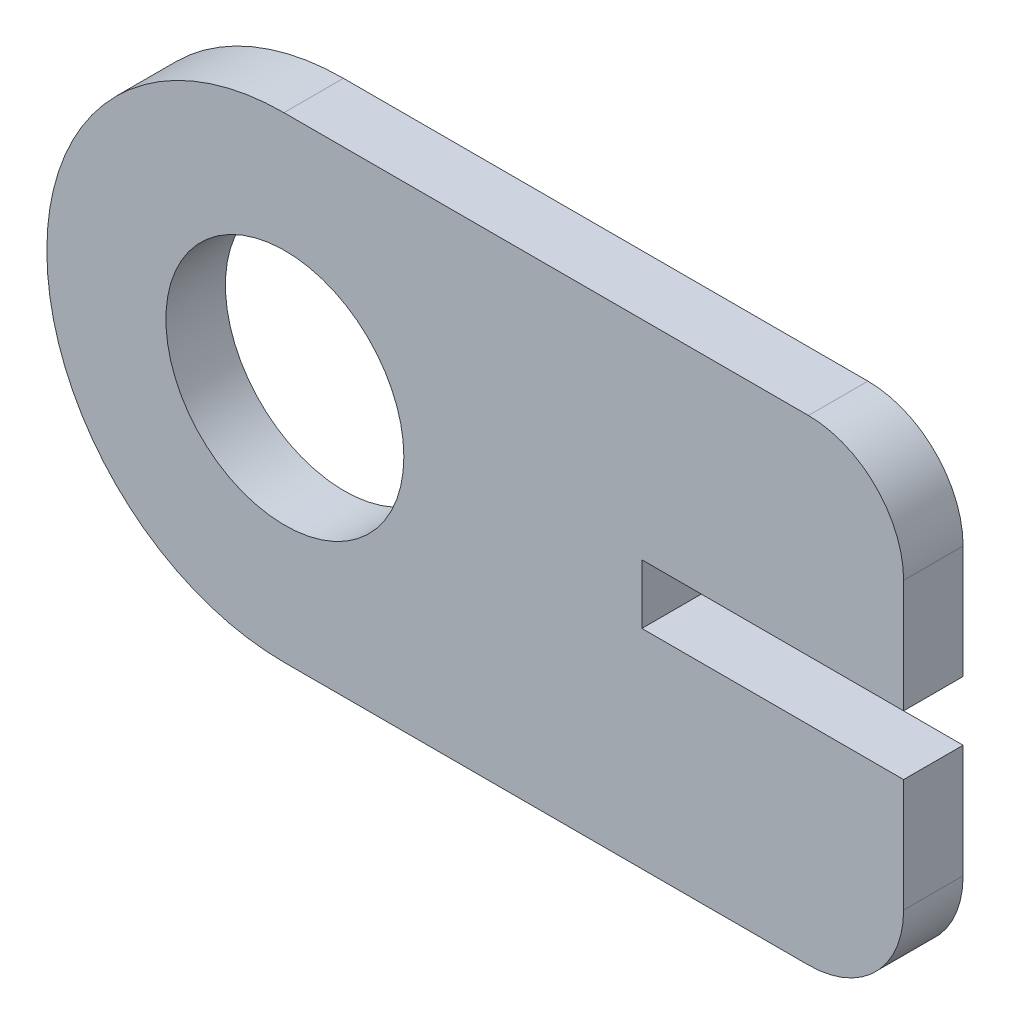
ISO-10303-21;
HEADER;
FILE_DESCRIPTION(('STEP AP214'),'2;1');
FILE_NAME('part.step','',(''),(''),'','','');
FILE_SCHEMA(('AUTOMOTIVE_DESIGN { 1 0 10303 214 1 1 1 1 }'));
ENDSEC;
DATA;
#1=APPLICATION_CONTEXT('core data for automotive mechanical design processes');
#2=APPLICATION_PROTOCOL_DEFINITION('international standard','automotive_design',2000,#1);
#3=PRODUCT_CONTEXT('',#1,'mechanical');
#4=PRODUCT('Part','Part','',(#3));
#5=PRODUCT_RELATED_PRODUCT_CATEGORY('part','',(#4));
#6=PRODUCT_DEFINITION_FORMATION('','',#4);
#7=PRODUCT_DEFINITION_CONTEXT('part definition',#1,'design');
#8=PRODUCT_DEFINITION('design','',#6,#7);
#9=PRODUCT_DEFINITION_SHAPE('','',#8);
#10=(LENGTH_UNIT() NAMED_UNIT(*) SI_UNIT(.MILLI.,.METRE.));
#11=(NAMED_UNIT(*) PLANE_ANGLE_UNIT() SI_UNIT($,.RADIAN.));
#12=(NAMED_UNIT(*) SI_UNIT($,.STERADIAN.) SOLID_ANGLE_UNIT());
#13=UNCERTAINTY_MEASURE_WITH_UNIT(LENGTH_MEASURE(1.E-05),#10,'distance_accuracy_value','');
#14=(GEOMETRIC_REPRESENTATION_CONTEXT(3) GLOBAL_UNCERTAINTY_ASSIGNED_CONTEXT((#13)) GLOBAL_UNIT_ASSIGNED_CONTEXT((#10,
#11,#12)) REPRESENTATION_CONTEXT('',''));
#15=CARTESIAN_POINT('',(0.,0.,0.));
#16=DIRECTION('',(0.,0.,1.));
#17=DIRECTION('',(1.,0.,0.));
#18=AXIS2_PLACEMENT_3D('',#15,#16,#17);
#19=CARTESIAN_POINT('',(13.97,-3.81,1.5875));
#20=DIRECTION('',(0.,0.,1.));
#21=DIRECTION('',(1.,0.,0.));
#22=AXIS2_PLACEMENT_3D('',#19,#20,#21);
#23=PLANE('',#22);
#24=DIRECTION('',(1.,0.,0.));
#25=VECTOR('',#24,1.);
#26=CARTESIAN_POINT('',(16.51,0.793749999999999,1.5875));
#27=LINE('',#26,#25);
#28=CARTESIAN_POINT('',(9.525,0.79375,1.5875));
#29=VERTEX_POINT('',#28);
#30=CARTESIAN_POINT('',(16.51,0.793749999999999,1.5875));
#31=VERTEX_POINT('',#30);
#32=EDGE_CURVE('E181',#29,#31,#27,.T.);
#33=ORIENTED_EDGE('',*,*,#32,.T.);
#34=DIRECTION('',(0.,1.,0.));
#35=VECTOR('',#34,1.);
#36=CARTESIAN_POINT('',(16.51,3.80999999999998,1.5875));
#37=LINE('',#36,#35);
#38=CARTESIAN_POINT('',(16.51,3.80999999999998,1.5875));
#39=VERTEX_POINT('',#38);
#40=EDGE_CURVE('E109',#31,#39,#37,.T.);
#41=ORIENTED_EDGE('',*,*,#40,.T.);
#42=CARTESIAN_POINT('',(13.97,3.81,1.5875));
#43=DIRECTION('',(0.,0.,1.));
#44=DIRECTION('',(-1.,0.,0.));
#45=AXIS2_PLACEMENT_3D('',#42,#43,#44);
#46=CIRCLE('',#45,2.54);
#47=CARTESIAN_POINT('',(13.97,6.35,1.5875));
#48=VERTEX_POINT('',#47);
#49=EDGE_CURVE('E208',#39,#48,#46,.T.);
#50=ORIENTED_EDGE('',*,*,#49,.T.);
#51=DIRECTION('',(-1.,0.,0.));
#52=VECTOR('',#51,1.);
#53=CARTESIAN_POINT('',(-0.0253999999999541,6.35,1.5875));
#54=LINE('',#53,#52);
#55=CARTESIAN_POINT('',(-0.0253999999999541,6.35,1.5875));
#56=VERTEX_POINT('',#55);
#57=EDGE_CURVE('E227',#48,#56,#54,.T.);
#58=ORIENTED_EDGE('',*,*,#57,.T.);
#59=CARTESIAN_POINT('',(-0.0253999999999983,0.0254000000000001,1.5875));
#60=DIRECTION('',(0.,0.,1.));
#61=DIRECTION('',(1.,0.,0.));
#62=AXIS2_PLACEMENT_3D('',#59,#60,#61);
#63=CIRCLE('',#62,6.3246);
#64=CARTESIAN_POINT('',(-6.35,0.0253999999999587,1.5875));
#65=VERTEX_POINT('',#64);
#66=EDGE_CURVE('E224',#56,#65,#63,.T.);
#67=ORIENTED_EDGE('',*,*,#66,.T.);
#68=DIRECTION('',(0.,-1.,0.));
#69=VECTOR('',#68,1.);
#70=CARTESIAN_POINT('',(-6.35,0.0253999999999558,1.5875));
#71=LINE('',#70,#69);
#72=CARTESIAN_POINT('',(-6.35,-0.025399999999955,1.5875));
#73=VERTEX_POINT('',#72);
#74=EDGE_CURVE('E226',#65,#73,#71,.T.);
#75=ORIENTED_EDGE('',*,*,#74,.T.);
#76=CARTESIAN_POINT('',(-0.0253999999999983,-0.0253999999999992,1.5875));
#77=DIRECTION('',(0.,0.,1.));
#78=DIRECTION('',(1.,0.,0.));
#79=AXIS2_PLACEMENT_3D('',#76,#77,#78);
#80=CIRCLE('',#79,6.3246);
#81=CARTESIAN_POINT('',(-0.0253999999999546,-6.35,1.5875));
#82=VERTEX_POINT('',#81);
#83=EDGE_CURVE('E229',#73,#82,#80,.T.);
#84=ORIENTED_EDGE('',*,*,#83,.T.);
#85=DIRECTION('',(1.,0.,0.));
#86=VECTOR('',#85,1.);
#87=CARTESIAN_POINT('',(-0.0253999999999541,-6.35,1.5875));
#88=LINE('',#87,#86);
#89=CARTESIAN_POINT('',(13.97,-6.35,1.5875));
#90=VERTEX_POINT('',#89);
#91=EDGE_CURVE('E235',#82,#90,#88,.T.);
#92=ORIENTED_EDGE('',*,*,#91,.T.);
#93=CARTESIAN_POINT('',(13.97,-3.81,1.5875));
#94=DIRECTION('',(0.,0.,1.));
#95=DIRECTION('',(1.,0.,0.));
#96=AXIS2_PLACEMENT_3D('',#93,#94,#95);
#97=CIRCLE('',#96,2.54);
#98=CARTESIAN_POINT('',(16.51,-3.80999999999998,1.5875));
#99=VERTEX_POINT('',#98);
#100=EDGE_CURVE('E140',#90,#99,#97,.T.);
#101=ORIENTED_EDGE('',*,*,#100,.T.);
#102=DIRECTION('',(0.,1.,0.));
#103=VECTOR('',#102,1.);
#104=CARTESIAN_POINT('',(16.51,-0.793749999999999,1.5875));
#105=LINE('',#104,#103);
#106=CARTESIAN_POINT('',(16.51,-0.793749999999999,1.5875));
#107=VERTEX_POINT('',#106);
#108=EDGE_CURVE('E134',#99,#107,#105,.T.);
#109=ORIENTED_EDGE('',*,*,#108,.T.);
#110=DIRECTION('',(-1.,0.,0.));
#111=VECTOR('',#110,1.);
#112=CARTESIAN_POINT('',(16.51,-0.793749999999999,1.5875));
#113=LINE('',#112,#111);
#114=CARTESIAN_POINT('',(9.525,-0.79375,1.5875));
#115=VERTEX_POINT('',#114);
#116=EDGE_CURVE('E138',#107,#115,#113,.T.);
#117=ORIENTED_EDGE('',*,*,#116,.T.);
#118=DIRECTION('',(0.,1.,0.));
#119=VECTOR('',#118,1.);
#120=CARTESIAN_POINT('',(9.525,0.79375,1.5875));
#121=LINE('',#120,#119);
#122=EDGE_CURVE('E54',#115,#29,#121,.T.);
#123=ORIENTED_EDGE('',*,*,#122,.T.);
#124=EDGE_LOOP('',(#33,#41,#50,#58,#67,#75,#84,#92,#101,#109,#117,#123));
#125=FACE_BOUND('',#124,.T.);
#126=CARTESIAN_POINT('',(0.,0.,1.5875));
#127=DIRECTION('',(0.,0.,1.));
#128=DIRECTION('',(1.,0.,0.));
#129=AXIS2_PLACEMENT_3D('',#126,#127,#128);
#130=CIRCLE('',#129,3.175);
#131=CARTESIAN_POINT('',(3.175,0.,1.5875));
#132=VERTEX_POINT('',#131);
#133=EDGE_CURVE('E162',#132,#132,#130,.T.);
#134=ORIENTED_EDGE('',*,*,#133,.F.);
#135=EDGE_LOOP('',(#134));
#136=FACE_BOUND('',#135,.T.);
#137=ADVANCED_FACE('F37',(#125,#136),#23,.T.);
#138=CARTESIAN_POINT('',(13.97,-3.81,0.));
#139=DIRECTION('',(0.,0.,1.));
#140=DIRECTION('',(1.,0.,0.));
#141=AXIS2_PLACEMENT_3D('',#138,#139,#140);
#142=PLANE('',#141);
#143=DIRECTION('',(1.,0.,0.));
#144=VECTOR('',#143,1.);
#145=CARTESIAN_POINT('',(16.51,0.793749999999999,0.));
#146=LINE('',#145,#144);
#147=CARTESIAN_POINT('',(9.525,0.79375,0.));
#148=VERTEX_POINT('',#147);
#149=CARTESIAN_POINT('',(16.51,0.793749999999999,0.));
#150=VERTEX_POINT('',#149);
#151=EDGE_CURVE('E158',#148,#150,#146,.T.);
#152=ORIENTED_EDGE('',*,*,#151,.F.);
#153=DIRECTION('',(0.,1.,0.));
#154=VECTOR('',#153,1.);
#155=CARTESIAN_POINT('',(9.525,0.79375,0.));
#156=LINE('',#155,#154);
#157=CARTESIAN_POINT('',(9.525,-0.79375,0.));
#158=VERTEX_POINT('',#157);
#159=EDGE_CURVE('E101',#158,#148,#156,.T.);
#160=ORIENTED_EDGE('',*,*,#159,.F.);
#161=DIRECTION('',(-1.,0.,0.));
#162=VECTOR('',#161,1.);
#163=CARTESIAN_POINT('',(16.51,-0.793749999999999,0.));
#164=LINE('',#163,#162);
#165=CARTESIAN_POINT('',(16.51,-0.793749999999999,0.));
#166=VERTEX_POINT('',#165);
#167=EDGE_CURVE('E95',#166,#158,#164,.T.);
#168=ORIENTED_EDGE('',*,*,#167,.F.);
#169=DIRECTION('',(0.,1.,0.));
#170=VECTOR('',#169,1.);
#171=CARTESIAN_POINT('',(16.51,-0.793749999999999,0.));
#172=LINE('',#171,#170);
#173=CARTESIAN_POINT('',(16.51,-3.80999999999998,0.));
#174=VERTEX_POINT('',#173);
#175=EDGE_CURVE('E148',#174,#166,#172,.T.);
#176=ORIENTED_EDGE('',*,*,#175,.F.);
#177=CARTESIAN_POINT('',(13.97,-3.81,0.));
#178=DIRECTION('',(0.,0.,1.));
#179=DIRECTION('',(1.,0.,0.));
#180=AXIS2_PLACEMENT_3D('',#177,#178,#179);
#181=CIRCLE('',#180,2.54);
#182=CARTESIAN_POINT('',(13.97,-6.35,0.));
#183=VERTEX_POINT('',#182);
#184=EDGE_CURVE('E176',#183,#174,#181,.T.);
#185=ORIENTED_EDGE('',*,*,#184,.F.);
#186=DIRECTION('',(1.,0.,0.));
#187=VECTOR('',#186,1.);
#188=CARTESIAN_POINT('',(-0.0253999999999541,-6.35,0.));
#189=LINE('',#188,#187);
#190=CARTESIAN_POINT('',(-0.0253999999999546,-6.35,0.));
#191=VERTEX_POINT('',#190);
#192=EDGE_CURVE('E174',#191,#183,#189,.T.);
#193=ORIENTED_EDGE('',*,*,#192,.F.);
#194=CARTESIAN_POINT('',(-0.0253999999999983,-0.0253999999999992,0.));
#195=DIRECTION('',(0.,0.,1.));
#196=DIRECTION('',(1.,0.,0.));
#197=AXIS2_PLACEMENT_3D('',#194,#195,#196);
#198=CIRCLE('',#197,6.3246);
#199=CARTESIAN_POINT('',(-6.35,-0.025399999999955,0.));
#200=VERTEX_POINT('',#199);
#201=EDGE_CURVE('E172',#200,#191,#198,.T.);
#202=ORIENTED_EDGE('',*,*,#201,.F.);
#203=DIRECTION('',(0.,-1.,0.));
#204=VECTOR('',#203,1.);
#205=CARTESIAN_POINT('',(-6.35,0.0253999999999558,0.));
#206=LINE('',#205,#204);
#207=CARTESIAN_POINT('',(-6.35,0.0253999999999587,0.));
#208=VERTEX_POINT('',#207);
#209=EDGE_CURVE('E170',#208,#200,#206,.T.);
#210=ORIENTED_EDGE('',*,*,#209,.F.);
#211=CARTESIAN_POINT('',(-0.0253999999999983,0.0254000000000001,0.));
#212=DIRECTION('',(0.,0.,1.));
#213=DIRECTION('',(1.,0.,0.));
#214=AXIS2_PLACEMENT_3D('',#211,#212,#213);
#215=CIRCLE('',#214,6.3246);
#216=CARTESIAN_POINT('',(-0.0253999999999541,6.35,0.));
#217=VERTEX_POINT('',#216);
#218=EDGE_CURVE('E168',#217,#208,#215,.T.);
#219=ORIENTED_EDGE('',*,*,#218,.F.);
#220=DIRECTION('',(-1.,0.,0.));
#221=VECTOR('',#220,1.);
#222=CARTESIAN_POINT('',(-0.0253999999999541,6.35,0.));
#223=LINE('',#222,#221);
#224=CARTESIAN_POINT('',(13.97,6.35,0.));
#225=VERTEX_POINT('',#224);
#226=EDGE_CURVE('E166',#225,#217,#223,.T.);
#227=ORIENTED_EDGE('',*,*,#226,.F.);
#228=CARTESIAN_POINT('',(13.97,3.81,0.));
#229=DIRECTION('',(0.,0.,1.));
#230=DIRECTION('',(-1.,0.,0.));
#231=AXIS2_PLACEMENT_3D('',#228,#229,#230);
#232=CIRCLE('',#231,2.54);
#233=CARTESIAN_POINT('',(16.51,3.80999999999998,0.));
#234=VERTEX_POINT('',#233);
#235=EDGE_CURVE('E164',#234,#225,#232,.T.);
#236=ORIENTED_EDGE('',*,*,#235,.F.);
#237=DIRECTION('',(0.,1.,0.));
#238=VECTOR('',#237,1.);
#239=CARTESIAN_POINT('',(16.51,3.80999999999998,0.));
#240=LINE('',#239,#238);
#241=EDGE_CURVE('E161',#150,#234,#240,.T.);
#242=ORIENTED_EDGE('',*,*,#241,.F.);
#243=EDGE_LOOP('',(#152,#160,#168,#176,#185,#193,#202,#210,#219,#227,#236,#242));
#244=FACE_BOUND('',#243,.T.);
#245=CARTESIAN_POINT('',(0.,0.,0.));
#246=DIRECTION('',(0.,0.,1.));
#247=DIRECTION('',(1.,0.,0.));
#248=AXIS2_PLACEMENT_3D('',#245,#246,#247);
#249=CIRCLE('',#248,3.175);
#250=CARTESIAN_POINT('',(3.175,0.,0.));
#251=VERTEX_POINT('',#250);
#252=EDGE_CURVE('E382',#251,#251,#249,.T.);
#253=ORIENTED_EDGE('',*,*,#252,.T.);
#254=EDGE_LOOP('',(#253));
#255=FACE_BOUND('',#254,.T.);
#256=ADVANCED_FACE('F212',(#244,#255),#142,.F.);
#257=CARTESIAN_POINT('',(16.51,0.793749999999999,1.5875));
#258=DIRECTION('',(0.,1.,0.));
#259=DIRECTION('',(-1.,0.,0.));
#260=AXIS2_PLACEMENT_3D('',#257,#258,#259);
#261=PLANE('',#260);
#262=ORIENTED_EDGE('',*,*,#151,.T.);
#263=DIRECTION('',(0.,0.,-1.));
#264=VECTOR('',#263,1.);
#265=CARTESIAN_POINT('',(16.51,0.793749999999999,1.5875));
#266=LINE('',#265,#264);
#267=EDGE_CURVE('E11',#31,#150,#266,.T.);
#268=ORIENTED_EDGE('',*,*,#267,.F.);
#269=ORIENTED_EDGE('',*,*,#32,.F.);
#270=DIRECTION('',(0.,0.,-1.));
#271=VECTOR('',#270,1.);
#272=CARTESIAN_POINT('',(9.525,0.79375,1.5875));
#273=LINE('',#272,#271);
#274=EDGE_CURVE('E154',#29,#148,#273,.T.);
#275=ORIENTED_EDGE('',*,*,#274,.T.);
#276=EDGE_LOOP('',(#262,#268,#269,#275));
#277=FACE_BOUND('',#276,.T.);
#278=ADVANCED_FACE('F39',(#277),#261,.F.);
#279=CARTESIAN_POINT('',(16.51,3.80999999999998,1.5875));
#280=DIRECTION('',(-1.,0.,0.));
#281=DIRECTION('',(0.,0.,1.));
#282=AXIS2_PLACEMENT_3D('',#279,#280,#281);
#283=PLANE('',#282);
#284=ORIENTED_EDGE('',*,*,#241,.T.);
#285=DIRECTION('',(0.,0.,-1.));
#286=VECTOR('',#285,1.);
#287=CARTESIAN_POINT('',(16.51,3.80999999999998,1.5875));
#288=LINE('',#287,#286);
#289=EDGE_CURVE('E46',#39,#234,#288,.T.);
#290=ORIENTED_EDGE('',*,*,#289,.F.);
#291=ORIENTED_EDGE('',*,*,#40,.F.);
#292=ORIENTED_EDGE('',*,*,#267,.T.);
#293=EDGE_LOOP('',(#284,#290,#291,#292));
#294=FACE_BOUND('',#293,.T.);
#295=ADVANCED_FACE('F269',(#294),#283,.F.);
#296=CARTESIAN_POINT('',(13.97,3.81,1.5875));
#297=DIRECTION('',(0.,0.,-1.));
#298=DIRECTION('',(-1.,0.,0.));
#299=AXIS2_PLACEMENT_3D('',#296,#297,#298);
#300=CYLINDRICAL_SURFACE('',#299,2.54);
#301=ORIENTED_EDGE('',*,*,#235,.T.);
#302=DIRECTION('',(0.,0.,-1.));
#303=VECTOR('',#302,1.);
#304=CARTESIAN_POINT('',(13.97,6.35,1.5875));
#305=LINE('',#304,#303);
#306=EDGE_CURVE('E200',#48,#225,#305,.T.);
#307=ORIENTED_EDGE('',*,*,#306,.F.);
#308=ORIENTED_EDGE('',*,*,#49,.F.);
#309=ORIENTED_EDGE('',*,*,#289,.T.);
#310=EDGE_LOOP('',(#301,#307,#308,#309));
#311=FACE_BOUND('',#310,.T.);
#312=ADVANCED_FACE('F206',(#311),#300,.T.);
#313=CARTESIAN_POINT('',(-0.0253999999999541,6.35,1.5875));
#314=DIRECTION('',(0.,-1.,0.));
#315=DIRECTION('',(0.,0.,-1.));
#316=AXIS2_PLACEMENT_3D('',#313,#314,#315);
#317=PLANE('',#316);
#318=ORIENTED_EDGE('',*,*,#226,.T.);
#319=DIRECTION('',(0.,0.,-1.));
#320=VECTOR('',#319,1.);
#321=CARTESIAN_POINT('',(-0.0253999999999541,6.35,1.5875));
#322=LINE('',#321,#320);
#323=EDGE_CURVE('E197',#56,#217,#322,.T.);
#324=ORIENTED_EDGE('',*,*,#323,.F.);
#325=ORIENTED_EDGE('',*,*,#57,.F.);
#326=ORIENTED_EDGE('',*,*,#306,.T.);
#327=EDGE_LOOP('',(#318,#324,#325,#326));
#328=FACE_BOUND('',#327,.T.);
#329=ADVANCED_FACE('F218',(#328),#317,.F.);
#330=CARTESIAN_POINT('',(-0.0253999999999983,0.0254000000000001,1.5875));
#331=DIRECTION('',(0.,0.,-1.));
#332=DIRECTION('',(-1.,0.,0.));
#333=AXIS2_PLACEMENT_3D('',#330,#331,#332);
#334=CYLINDRICAL_SURFACE('',#333,6.3246);
#335=ORIENTED_EDGE('',*,*,#218,.T.);
#336=DIRECTION('',(0.,0.,-1.));
#337=VECTOR('',#336,1.);
#338=CARTESIAN_POINT('',(-6.35,0.0253999999999587,1.5875));
#339=LINE('',#338,#337);
#340=EDGE_CURVE('E194',#65,#208,#339,.T.);
#341=ORIENTED_EDGE('',*,*,#340,.F.);
#342=ORIENTED_EDGE('',*,*,#66,.F.);
#343=ORIENTED_EDGE('',*,*,#323,.T.);
#344=EDGE_LOOP('',(#335,#341,#342,#343));
#345=FACE_BOUND('',#344,.T.);
#346=ADVANCED_FACE('F222',(#345),#334,.T.);
#347=CARTESIAN_POINT('',(-6.35,0.0253999999999558,1.5875));
#348=DIRECTION('',(1.,0.,0.));
#349=DIRECTION('',(0.,0.,-1.));
#350=AXIS2_PLACEMENT_3D('',#347,#348,#349);
#351=PLANE('',#350);
#352=ORIENTED_EDGE('',*,*,#209,.T.);
#353=DIRECTION('',(0.,0.,-1.));
#354=VECTOR('',#353,1.);
#355=CARTESIAN_POINT('',(-6.35,-0.025399999999955,1.5875));
#356=LINE('',#355,#354);
#357=EDGE_CURVE('E191',#73,#200,#356,.T.);
#358=ORIENTED_EDGE('',*,*,#357,.F.);
#359=ORIENTED_EDGE('',*,*,#74,.F.);
#360=ORIENTED_EDGE('',*,*,#340,.T.);
#361=EDGE_LOOP('',(#352,#358,#359,#360));
#362=FACE_BOUND('',#361,.T.);
#363=ADVANCED_FACE('F282',(#362),#351,.F.);
#364=CARTESIAN_POINT('',(-0.0253999999999983,-0.0253999999999992,1.5875));
#365=DIRECTION('',(0.,0.,-1.));
#366=DIRECTION('',(-1.,0.,0.));
#367=AXIS2_PLACEMENT_3D('',#364,#365,#366);
#368=CYLINDRICAL_SURFACE('',#367,6.3246);
#369=ORIENTED_EDGE('',*,*,#201,.T.);
#370=DIRECTION('',(0.,0.,-1.));
#371=VECTOR('',#370,1.);
#372=CARTESIAN_POINT('',(-0.0253999999999546,-6.35,1.5875));
#373=LINE('',#372,#371);
#374=EDGE_CURVE('E188',#82,#191,#373,.T.);
#375=ORIENTED_EDGE('',*,*,#374,.F.);
#376=ORIENTED_EDGE('',*,*,#83,.F.);
#377=ORIENTED_EDGE('',*,*,#357,.T.);
#378=EDGE_LOOP('',(#369,#375,#376,#377));
#379=FACE_BOUND('',#378,.T.);
#380=ADVANCED_FACE('F285',(#379),#368,.T.);
#381=CARTESIAN_POINT('',(-0.0253999999999541,-6.35,1.5875));
#382=DIRECTION('',(0.,1.,0.));
#383=DIRECTION('',(0.,0.,1.));
#384=AXIS2_PLACEMENT_3D('',#381,#382,#383);
#385=PLANE('',#384);
#386=ORIENTED_EDGE('',*,*,#192,.T.);
#387=DIRECTION('',(0.,0.,-1.));
#388=VECTOR('',#387,1.);
#389=CARTESIAN_POINT('',(13.97,-6.35,1.5875));
#390=LINE('',#389,#388);
#391=EDGE_CURVE('E185',#90,#183,#390,.T.);
#392=ORIENTED_EDGE('',*,*,#391,.F.);
#393=ORIENTED_EDGE('',*,*,#91,.F.);
#394=ORIENTED_EDGE('',*,*,#374,.T.);
#395=EDGE_LOOP('',(#386,#392,#393,#394));
#396=FACE_BOUND('',#395,.T.);
#397=ADVANCED_FACE('F241',(#396),#385,.F.);
#398=CARTESIAN_POINT('',(13.97,-3.81,1.5875));
#399=DIRECTION('',(0.,0.,-1.));
#400=DIRECTION('',(-1.,0.,0.));
#401=AXIS2_PLACEMENT_3D('',#398,#399,#400);
#402=CYLINDRICAL_SURFACE('',#401,2.54);
#403=ORIENTED_EDGE('',*,*,#184,.T.);
#404=DIRECTION('',(0.,0.,-1.));
#405=VECTOR('',#404,1.);
#406=CARTESIAN_POINT('',(16.51,-3.80999999999998,1.5875));
#407=LINE('',#406,#405);
#408=EDGE_CURVE('E149',#99,#174,#407,.T.);
#409=ORIENTED_EDGE('',*,*,#408,.F.);
#410=ORIENTED_EDGE('',*,*,#100,.F.);
#411=ORIENTED_EDGE('',*,*,#391,.T.);
#412=EDGE_LOOP('',(#403,#409,#410,#411));
#413=FACE_BOUND('',#412,.T.);
#414=ADVANCED_FACE('F245',(#413),#402,.T.);
#415=CARTESIAN_POINT('',(16.51,-0.793749999999999,1.5875));
#416=DIRECTION('',(-1.,0.,0.));
#417=DIRECTION('',(0.,0.,1.));
#418=AXIS2_PLACEMENT_3D('',#415,#416,#417);
#419=PLANE('',#418);
#420=ORIENTED_EDGE('',*,*,#175,.T.);
#421=DIRECTION('',(0.,0.,-1.));
#422=VECTOR('',#421,1.);
#423=CARTESIAN_POINT('',(16.51,-0.793749999999999,1.5875));
#424=LINE('',#423,#422);
#425=EDGE_CURVE('E145',#107,#166,#424,.T.);
#426=ORIENTED_EDGE('',*,*,#425,.F.);
#427=ORIENTED_EDGE('',*,*,#108,.F.);
#428=ORIENTED_EDGE('',*,*,#408,.T.);
#429=EDGE_LOOP('',(#420,#426,#427,#428));
#430=FACE_BOUND('',#429,.T.);
#431=ADVANCED_FACE('F146',(#430),#419,.F.);
#432=CARTESIAN_POINT('',(16.51,-0.793749999999999,1.5875));
#433=DIRECTION('',(0.,-1.,0.));
#434=DIRECTION('',(1.,0.,0.));
#435=AXIS2_PLACEMENT_3D('',#432,#433,#434);
#436=PLANE('',#435);
#437=ORIENTED_EDGE('',*,*,#167,.T.);
#438=DIRECTION('',(0.,0.,-1.));
#439=VECTOR('',#438,1.);
#440=CARTESIAN_POINT('',(9.525,-0.79375,1.5875));
#441=LINE('',#440,#439);
#442=EDGE_CURVE('E150',#115,#158,#441,.T.);
#443=ORIENTED_EDGE('',*,*,#442,.F.);
#444=ORIENTED_EDGE('',*,*,#116,.F.);
#445=ORIENTED_EDGE('',*,*,#425,.T.);
#446=EDGE_LOOP('',(#437,#443,#444,#445));
#447=FACE_BOUND('',#446,.T.);
#448=ADVANCED_FACE('F152',(#447),#436,.F.);
#449=CARTESIAN_POINT('',(9.525,0.79375,1.5875));
#450=DIRECTION('',(-1.,0.,0.));
#451=DIRECTION('',(0.,0.,1.));
#452=AXIS2_PLACEMENT_3D('',#449,#450,#451);
#453=PLANE('',#452);
#454=ORIENTED_EDGE('',*,*,#159,.T.);
#455=ORIENTED_EDGE('',*,*,#274,.F.);
#456=ORIENTED_EDGE('',*,*,#122,.F.);
#457=ORIENTED_EDGE('',*,*,#442,.T.);
#458=EDGE_LOOP('',(#454,#455,#456,#457));
#459=FACE_BOUND('',#458,.T.);
#460=ADVANCED_FACE('F249',(#459),#453,.F.);
#461=CARTESIAN_POINT('',(0.,0.,1.5875));
#462=DIRECTION('',(0.,0.,-1.));
#463=DIRECTION('',(-1.,0.,0.));
#464=AXIS2_PLACEMENT_3D('',#461,#462,#463);
#465=CYLINDRICAL_SURFACE('',#464,3.175);
#466=ORIENTED_EDGE('',*,*,#133,.T.);
#467=EDGE_LOOP('',(#466));
#468=FACE_BOUND('',#467,.T.);
#469=ORIENTED_EDGE('',*,*,#252,.F.);
#470=EDGE_LOOP('',(#469));
#471=FACE_BOUND('',#470,.T.);
#472=ADVANCED_FACE('F251',(#468,#471),#465,.F.);
#473=CLOSED_SHELL('',(#137,#256,#278,#295,#312,#329,#346,#363,#380,#397,#414,#431,#448,#460,#472));
#474=MANIFOLD_SOLID_BREP('B2',#473);
#475=ADVANCED_BREP_SHAPE_REPRESENTATION('',(#18,#474),#14);
#476=SHAPE_DEFINITION_REPRESENTATION(#9,#475);
ENDSEC;
END-ISO-10303-21;
